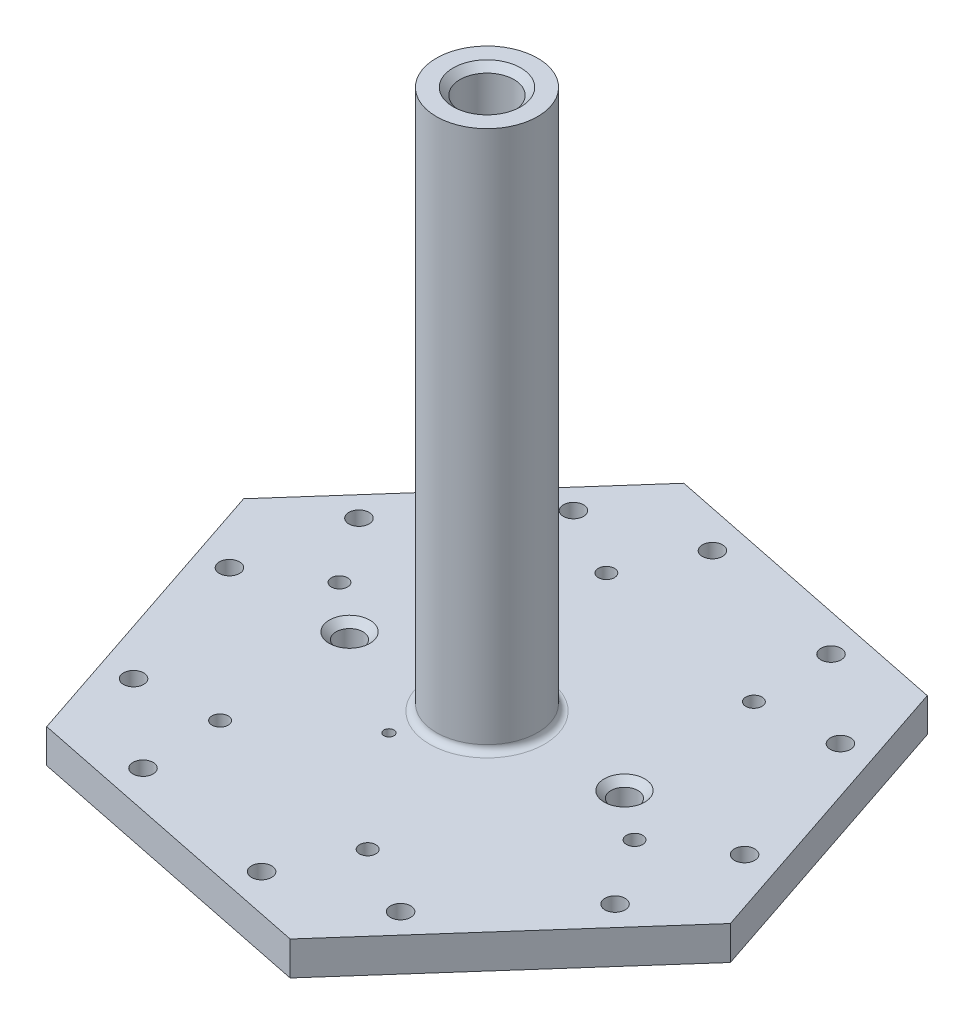
ISO-10303-21;
HEADER;
FILE_DESCRIPTION(('STEP AP214'),'2;1');
FILE_NAME('part.step','',(''),(''),'','','');
FILE_SCHEMA(('AUTOMOTIVE_DESIGN { 1 0 10303 214 1 1 1 1 }'));
ENDSEC;
DATA;
#1=APPLICATION_CONTEXT('core data for automotive mechanical design processes');
#2=APPLICATION_PROTOCOL_DEFINITION('international standard','automotive_design',2000,#1);
#3=PRODUCT_CONTEXT('',#1,'mechanical');
#4=PRODUCT('Part','Part','',(#3));
#5=PRODUCT_RELATED_PRODUCT_CATEGORY('part','',(#4));
#6=PRODUCT_DEFINITION_FORMATION('','',#4);
#7=PRODUCT_DEFINITION_CONTEXT('part definition',#1,'design');
#8=PRODUCT_DEFINITION('design','',#6,#7);
#9=PRODUCT_DEFINITION_SHAPE('','',#8);
#10=(LENGTH_UNIT() NAMED_UNIT(*) SI_UNIT(.MILLI.,.METRE.));
#11=(NAMED_UNIT(*) PLANE_ANGLE_UNIT() SI_UNIT($,.RADIAN.));
#12=(NAMED_UNIT(*) SI_UNIT($,.STERADIAN.) SOLID_ANGLE_UNIT());
#13=UNCERTAINTY_MEASURE_WITH_UNIT(LENGTH_MEASURE(1.E-05),#10,'distance_accuracy_value','');
#14=(GEOMETRIC_REPRESENTATION_CONTEXT(3) GLOBAL_UNCERTAINTY_ASSIGNED_CONTEXT((#13)) GLOBAL_UNIT_ASSIGNED_CONTEXT((#10,
#11,#12)) REPRESENTATION_CONTEXT('',''));
#15=CARTESIAN_POINT('',(0.,0.,0.));
#16=DIRECTION('',(0.,0.,1.));
#17=DIRECTION('',(1.,0.,0.));
#18=AXIS2_PLACEMENT_3D('',#15,#16,#17);
#19=CARTESIAN_POINT('',(0.,6.35,0.));
#20=DIRECTION('',(0.,1.,0.));
#21=DIRECTION('',(0.,0.,1.));
#22=AXIS2_PLACEMENT_3D('',#19,#20,#21);
#23=PLANE('',#22);
#24=CARTESIAN_POINT('',(4.94245146917436,6.35,47.3401714823136));
#25=DIRECTION('',(0.,1.,0.));
#26=DIRECTION('',(0.,0.,1.));
#27=AXIS2_PLACEMENT_3D('',#24,#25,#26);
#28=CIRCLE('',#27,1.89865000000001);
#29=CARTESIAN_POINT('',(4.94245146917436,6.35,49.2388214823136));
#30=VERTEX_POINT('',#29);
#31=EDGE_CURVE('E329',#30,#30,#28,.T.);
#32=ORIENTED_EDGE('',*,*,#31,.F.);
#33=EDGE_LOOP('',(#32));
#34=FACE_BOUND('',#33,.T.);
#35=CARTESIAN_POINT('',(-23.0581241038225,6.35,41.6394353385432));
#36=DIRECTION('',(0.,1.,0.));
#37=DIRECTION('',(0.,0.,1.));
#38=AXIS2_PLACEMENT_3D('',#35,#36,#37);
#39=CIRCLE('',#38,1.89865);
#40=CARTESIAN_POINT('',(-23.0581241038225,6.35,43.5380853385432));
#41=VERTEX_POINT('',#40);
#42=EDGE_CURVE('E331',#41,#41,#39,.T.);
#43=ORIENTED_EDGE('',*,*,#42,.F.);
#44=EDGE_LOOP('',(#43));
#45=FACE_BOUND('',#44,.T.);
#46=CARTESIAN_POINT('',(43.4690168577824,6.35,19.38979721188));
#47=DIRECTION('',(0.,1.,0.));
#48=DIRECTION('',(0.,0.,1.));
#49=AXIS2_PLACEMENT_3D('',#46,#47,#48);
#50=CIRCLE('',#49,1.89865);
#51=CARTESIAN_POINT('',(43.4690168577824,6.35,21.28844721188));
#52=VERTEX_POINT('',#51);
#53=EDGE_CURVE('E337',#52,#52,#50,.T.);
#54=ORIENTED_EDGE('',*,*,#53,.F.);
#55=EDGE_LOOP('',(#54));
#56=FACE_BOUND('',#55,.T.);
#57=CARTESIAN_POINT('',(24.5317467505067,6.35,40.7886389067961));
#58=DIRECTION('',(0.,1.,0.));
#59=DIRECTION('',(0.,0.,1.));
#60=AXIS2_PLACEMENT_3D('',#57,#58,#59);
#61=CIRCLE('',#60,1.89865);
#62=CARTESIAN_POINT('',(24.5317467505067,6.35,42.6872889067961));
#63=VERTEX_POINT('',#62);
#64=EDGE_CURVE('E343',#63,#63,#61,.T.);
#65=ORIENTED_EDGE('',*,*,#64,.F.);
#66=EDGE_LOOP('',(#65));
#67=FACE_BOUND('',#66,.T.);
#68=CARTESIAN_POINT('',(38.5265653886079,6.35,-27.9503742704337));
#69=DIRECTION('',(0.,1.,0.));
#70=DIRECTION('',(0.,0.,1.));
#71=AXIS2_PLACEMENT_3D('',#68,#69,#70);
#72=CIRCLE('',#71,1.89865);
#73=CARTESIAN_POINT('',(38.5265653886079,6.35,-26.0517242704337));
#74=VERTEX_POINT('',#73);
#75=EDGE_CURVE('E349',#74,#74,#72,.T.);
#76=ORIENTED_EDGE('',*,*,#75,.F.);
#77=EDGE_LOOP('',(#76));
#78=FACE_BOUND('',#77,.T.);
#79=CARTESIAN_POINT('',(47.5898708543291,6.35,-0.85079643174722));
#80=DIRECTION('',(0.,1.,0.));
#81=DIRECTION('',(0.,0.,1.));
#82=AXIS2_PLACEMENT_3D('',#79,#80,#81);
#83=CIRCLE('',#82,1.89865);
#84=CARTESIAN_POINT('',(47.5898708543291,6.35,1.04785356825278));
#85=VERTEX_POINT('',#84);
#86=EDGE_CURVE('E355',#85,#85,#83,.T.);
#87=ORIENTED_EDGE('',*,*,#86,.F.);
#88=EDGE_LOOP('',(#87));
#89=FACE_BOUND('',#88,.T.);
#90=CARTESIAN_POINT('',(-4.94245146917469,6.35,-47.3401714823136));
#91=DIRECTION('',(0.,1.,0.));
#92=DIRECTION('',(0.,0.,1.));
#93=AXIS2_PLACEMENT_3D('',#90,#91,#92);
#94=CIRCLE('',#93,1.89865000000001);
#95=CARTESIAN_POINT('',(-4.94245146917469,6.35,-45.4415214823136));
#96=VERTEX_POINT('',#95);
#97=EDGE_CURVE('E361',#96,#96,#94,.T.);
#98=ORIENTED_EDGE('',*,*,#97,.F.);
#99=EDGE_LOOP('',(#98));
#100=FACE_BOUND('',#99,.T.);
#101=CARTESIAN_POINT('',(23.0581241038222,6.35,-41.6394353385434));
#102=DIRECTION('',(0.,1.,0.));
#103=DIRECTION('',(0.,0.,1.));
#104=AXIS2_PLACEMENT_3D('',#101,#102,#103);
#105=CIRCLE('',#104,1.89865);
#106=CARTESIAN_POINT('',(23.0581241038222,6.35,-39.7407853385434));
#107=VERTEX_POINT('',#106);
#108=EDGE_CURVE('E367',#107,#107,#105,.T.);
#109=ORIENTED_EDGE('',*,*,#108,.F.);
#110=EDGE_LOOP('',(#109));
#111=FACE_BOUND('',#110,.T.);
#112=CARTESIAN_POINT('',(-43.4690168577826,6.35,-19.3897972118797));
#113=DIRECTION('',(0.,1.,0.));
#114=DIRECTION('',(0.,0.,1.));
#115=AXIS2_PLACEMENT_3D('',#112,#113,#114);
#116=CIRCLE('',#115,1.89865);
#117=CARTESIAN_POINT('',(-43.4690168577826,6.35,-17.4911472118797));
#118=VERTEX_POINT('',#117);
#119=EDGE_CURVE('E373',#118,#118,#116,.T.);
#120=ORIENTED_EDGE('',*,*,#119,.F.);
#121=EDGE_LOOP('',(#120));
#122=FACE_BOUND('',#121,.T.);
#123=CARTESIAN_POINT('',(-24.531746750507,6.35,-40.788638906796));
#124=DIRECTION('',(0.,1.,0.));
#125=DIRECTION('',(0.,0.,1.));
#126=AXIS2_PLACEMENT_3D('',#123,#124,#125);
#127=CIRCLE('',#126,1.89865);
#128=CARTESIAN_POINT('',(-24.531746750507,6.35,-38.889988906796));
#129=VERTEX_POINT('',#128);
#130=EDGE_CURVE('E379',#129,#129,#127,.T.);
#131=ORIENTED_EDGE('',*,*,#130,.F.);
#132=EDGE_LOOP('',(#131));
#133=FACE_BOUND('',#132,.T.);
#134=CARTESIAN_POINT('',(-38.5265653886077,6.35,27.950374270434));
#135=DIRECTION('',(0.,1.,0.));
#136=DIRECTION('',(0.,0.,1.));
#137=AXIS2_PLACEMENT_3D('',#134,#135,#136);
#138=CIRCLE('',#137,1.89865);
#139=CARTESIAN_POINT('',(-38.5265653886077,6.35,29.849024270434));
#140=VERTEX_POINT('',#139);
#141=EDGE_CURVE('E385',#140,#140,#138,.T.);
#142=ORIENTED_EDGE('',*,*,#141,.F.);
#143=EDGE_LOOP('',(#142));
#144=FACE_BOUND('',#143,.T.);
#145=CARTESIAN_POINT('',(-47.5898708543291,6.35,0.850796431747552));
#146=DIRECTION('',(0.,1.,0.));
#147=DIRECTION('',(0.,0.,1.));
#148=AXIS2_PLACEMENT_3D('',#145,#146,#147);
#149=CIRCLE('',#148,1.89865);
#150=CARTESIAN_POINT('',(-47.5898708543291,6.35,2.74944643174755));
#151=VERTEX_POINT('',#150);
#152=EDGE_CURVE('E391',#151,#151,#149,.T.);
#153=ORIENTED_EDGE('',*,*,#152,.F.);
#154=EDGE_LOOP('',(#153));
#155=FACE_BOUND('',#154,.T.);
#156=CARTESIAN_POINT('',(-23.5663805779425,6.34999999999999,26.6296696647828));
#157=DIRECTION('',(0.,1.,0.));
#158=DIRECTION('',(0.,0.,1.));
#159=AXIS2_PLACEMENT_3D('',#156,#157,#158);
#160=CIRCLE('',#159,1.524);
#161=CARTESIAN_POINT('',(-23.5663805779425,6.34999999999999,28.1536696647828));
#162=VERTEX_POINT('',#161);
#163=EDGE_CURVE('E402',#162,#162,#160,.T.);
#164=ORIENTED_EDGE('',*,*,#163,.F.);
#165=EDGE_LOOP('',(#164));
#166=FACE_BOUND('',#165,.T.);
#167=CARTESIAN_POINT('',(-34.8451607130606,6.34999999999999,-7.09424942336094));
#168=DIRECTION('',(0.,1.,0.));
#169=DIRECTION('',(0.,0.,1.));
#170=AXIS2_PLACEMENT_3D('',#167,#168,#169);
#171=CIRCLE('',#170,1.524);
#172=CARTESIAN_POINT('',(-34.8451607130606,6.34999999999999,-5.57024942336094));
#173=VERTEX_POINT('',#172);
#174=EDGE_CURVE('E408',#173,#173,#171,.T.);
#175=ORIENTED_EDGE('',*,*,#174,.F.);
#176=EDGE_LOOP('',(#175));
#177=FACE_BOUND('',#176,.T.);
#178=CARTESIAN_POINT('',(-11.2787801351162,6.34999999999999,-33.7239190881444));
#179=DIRECTION('',(0.,1.,0.));
#180=DIRECTION('',(0.,0.,1.));
#181=AXIS2_PLACEMENT_3D('',#178,#179,#180);
#182=CIRCLE('',#181,1.524);
#183=CARTESIAN_POINT('',(-11.2787801351162,6.34999999999999,-32.1999190881444));
#184=VERTEX_POINT('',#183);
#185=EDGE_CURVE('E414',#184,#184,#182,.T.);
#186=ORIENTED_EDGE('',*,*,#185,.F.);
#187=EDGE_LOOP('',(#186));
#188=FACE_BOUND('',#187,.T.);
#189=CARTESIAN_POINT('',(23.5663805779463,6.34999999999999,-26.6296696647841));
#190=DIRECTION('',(0.,1.,0.));
#191=DIRECTION('',(0.,0.,1.));
#192=AXIS2_PLACEMENT_3D('',#189,#190,#191);
#193=CIRCLE('',#192,1.524);
#194=CARTESIAN_POINT('',(23.5663805779463,6.34999999999999,-25.1056696647841));
#195=VERTEX_POINT('',#194);
#196=EDGE_CURVE('E420',#195,#195,#193,.T.);
#197=ORIENTED_EDGE('',*,*,#196,.F.);
#198=EDGE_LOOP('',(#197));
#199=FACE_BOUND('',#198,.T.);
#200=CARTESIAN_POINT('',(34.8451607130644,6.34999999999999,7.09424942335965));
#201=DIRECTION('',(0.,1.,0.));
#202=DIRECTION('',(0.,0.,1.));
#203=AXIS2_PLACEMENT_3D('',#200,#201,#202);
#204=CIRCLE('',#203,1.524);
#205=CARTESIAN_POINT('',(34.8451607130644,6.34999999999999,8.61824942335965));
#206=VERTEX_POINT('',#205);
#207=EDGE_CURVE('E426',#206,#206,#204,.T.);
#208=ORIENTED_EDGE('',*,*,#207,.F.);
#209=EDGE_LOOP('',(#208));
#210=FACE_BOUND('',#209,.T.);
#211=CARTESIAN_POINT('',(11.27878013512,6.34999999999999,33.7239190881431));
#212=DIRECTION('',(0.,1.,0.));
#213=DIRECTION('',(0.,0.,1.));
#214=AXIS2_PLACEMENT_3D('',#211,#212,#213);
#215=CIRCLE('',#214,1.524);
#216=CARTESIAN_POINT('',(11.27878013512,6.34999999999999,35.2479190881431));
#217=VERTEX_POINT('',#216);
#218=EDGE_CURVE('E182',#217,#217,#215,.T.);
#219=ORIENTED_EDGE('',*,*,#218,.F.);
#220=EDGE_LOOP('',(#219));
#221=FACE_BOUND('',#220,.T.);
#222=CARTESIAN_POINT('',(-25.8549980308621,6.35,0.));
#223=DIRECTION('',(0.,1.,0.));
#224=DIRECTION('',(0.,0.,1.));
#225=AXIS2_PLACEMENT_3D('',#222,#223,#224);
#226=CIRCLE('',#225,3.81000000000001);
#227=CARTESIAN_POINT('',(-25.8549980308621,6.35,3.81000000000001));
#228=VERTEX_POINT('',#227);
#229=EDGE_CURVE('E42',#228,#228,#226,.F.);
#230=ORIENTED_EDGE('',*,*,#229,.T.);
#231=EDGE_LOOP('',(#230));
#232=FACE_BOUND('',#231,.T.);
#233=CARTESIAN_POINT('',(25.8549980308621,6.35,0.));
#234=DIRECTION('',(0.,1.,0.));
#235=DIRECTION('',(0.,0.,1.));
#236=AXIS2_PLACEMENT_3D('',#233,#234,#235);
#237=CIRCLE('',#236,3.81000000000001);
#238=CARTESIAN_POINT('',(25.8549980308621,6.35,3.81000000000001));
#239=VERTEX_POINT('',#238);
#240=EDGE_CURVE('E153',#239,#239,#237,.F.);
#241=ORIENTED_EDGE('',*,*,#240,.T.);
#242=EDGE_LOOP('',(#241));
#243=FACE_BOUND('',#242,.T.);
#244=CARTESIAN_POINT('',(-5.68211090376942,6.35,12.7622300432669));
#245=DIRECTION('',(0.,1.,0.));
#246=DIRECTION('',(0.,0.,1.));
#247=AXIS2_PLACEMENT_3D('',#244,#245,#246);
#248=CIRCLE('',#247,0.952500000000001);
#249=CARTESIAN_POINT('',(-5.68211090376942,6.35,13.7147300432669));
#250=VERTEX_POINT('',#249);
#251=EDGE_CURVE('E175',#250,#250,#248,.T.);
#252=ORIENTED_EDGE('',*,*,#251,.F.);
#253=EDGE_LOOP('',(#252));
#254=FACE_BOUND('',#253,.T.);
#255=CARTESIAN_POINT('',(0.,6.35,0.));
#256=DIRECTION('',(0.,1.,0.));
#257=DIRECTION('',(0.,0.,1.));
#258=AXIS2_PLACEMENT_3D('',#255,#256,#257);
#259=CIRCLE('',#258,10.795);
#260=CARTESIAN_POINT('',(0.,6.35,10.795));
#261=VERTEX_POINT('',#260);
#262=EDGE_CURVE('E141',#261,#261,#259,.F.);
#263=ORIENTED_EDGE('',*,*,#262,.T.);
#264=EDGE_LOOP('',(#263));
#265=FACE_BOUND('',#264,.T.);
#266=DIRECTION('',(0.979897657847662,0.,0.199500827428524));
#267=VECTOR('',#266,1.);
#268=CARTESIAN_POINT('',(-38.8744462014299,6.35,43.9275627125551));
#269=LINE('',#268,#267);
#270=CARTESIAN_POINT('',(-38.8744462014299,6.35,43.9275627125551));
#271=VERTEX_POINT('',#270);
#272=CARTESIAN_POINT('',(18.6051621346919,6.35,55.6300393247673));
#273=VERTEX_POINT('',#272);
#274=EDGE_CURVE('E129',#271,#273,#269,.T.);
#275=ORIENTED_EDGE('',*,*,#274,.T.);
#276=DIRECTION('',(0.662721613552948,0.,-0.748865851090686));
#277=VECTOR('',#276,1.);
#278=CARTESIAN_POINT('',(18.6051621346919,6.35,55.6300393247673));
#279=LINE('',#278,#277);
#280=CARTESIAN_POINT('',(57.4796083361218,6.35,11.7024766122122));
#281=VERTEX_POINT('',#280);
#282=EDGE_CURVE('E88',#273,#281,#279,.T.);
#283=ORIENTED_EDGE('',*,*,#282,.T.);
#284=DIRECTION('',(-0.317176044294714,0.,-0.948366678519209));
#285=VECTOR('',#284,1.);
#286=CARTESIAN_POINT('',(57.4796083361218,6.35,11.7024766122122));
#287=LINE('',#286,#285);
#288=CARTESIAN_POINT('',(38.8744462014299,6.35,-43.9275627125552));
#289=VERTEX_POINT('',#288);
#290=EDGE_CURVE('E100',#281,#289,#287,.T.);
#291=ORIENTED_EDGE('',*,*,#290,.T.);
#292=DIRECTION('',(-0.979897657847662,0.,-0.199500827428524));
#293=VECTOR('',#292,1.);
#294=CARTESIAN_POINT('',(38.8744462014299,6.35,-43.9275627125552));
#295=LINE('',#294,#293);
#296=CARTESIAN_POINT('',(-18.6051621346919,6.35,-55.6300393247674));
#297=VERTEX_POINT('',#296);
#298=EDGE_CURVE('E95',#289,#297,#295,.T.);
#299=ORIENTED_EDGE('',*,*,#298,.T.);
#300=DIRECTION('',(-0.662721613552948,0.,0.748865851090686));
#301=VECTOR('',#300,1.);
#302=CARTESIAN_POINT('',(-18.6051621346919,6.35,-55.6300393247674));
#303=LINE('',#302,#301);
#304=CARTESIAN_POINT('',(-57.4796083361218,6.35,-11.7024766122122));
#305=VERTEX_POINT('',#304);
#306=EDGE_CURVE('E98',#297,#305,#303,.T.);
#307=ORIENTED_EDGE('',*,*,#306,.T.);
#308=DIRECTION('',(0.317176044294714,0.,0.948366678519209));
#309=VECTOR('',#308,1.);
#310=CARTESIAN_POINT('',(-57.4796083361218,6.35,-11.7024766122122));
#311=LINE('',#310,#309);
#312=EDGE_CURVE('E50',#305,#271,#311,.T.);
#313=ORIENTED_EDGE('',*,*,#312,.T.);
#314=EDGE_LOOP('',(#275,#283,#291,#299,#307,#313));
#315=FACE_BOUND('',#314,.T.);
#316=ADVANCED_FACE('F33',(#34,#45,#56,#67,#78,#89,#100,#111,#122,#133,#144,#155,#166,#177,#188,
#199,#210,#221,#232,#243,#254,#265,#315),#23,.T.);
#317=CARTESIAN_POINT('',(-38.8744462014299,6.35,43.9275627125551));
#318=DIRECTION('',(0.199500827428524,0.,-0.979897657847662));
#319=DIRECTION('',(-0.979897657847662,0.,-0.199500827428524));
#320=AXIS2_PLACEMENT_3D('',#317,#318,#319);
#321=PLANE('',#320);
#322=DIRECTION('',(0.979897657847662,0.,0.199500827428524));
#323=VECTOR('',#322,1.);
#324=CARTESIAN_POINT('',(-38.8744462014299,0.,43.9275627125551));
#325=LINE('',#324,#323);
#326=CARTESIAN_POINT('',(-38.8744462014299,0.,43.9275627125551));
#327=VERTEX_POINT('',#326);
#328=CARTESIAN_POINT('',(18.6051621346919,0.,55.6300393247673));
#329=VERTEX_POINT('',#328);
#330=EDGE_CURVE('E118',#327,#329,#325,.T.);
#331=ORIENTED_EDGE('',*,*,#330,.T.);
#332=DIRECTION('',(0.,-1.,0.));
#333=VECTOR('',#332,1.);
#334=CARTESIAN_POINT('',(18.6051621346919,6.35,55.6300393247673));
#335=LINE('',#334,#333);
#336=EDGE_CURVE('E136',#273,#329,#335,.T.);
#337=ORIENTED_EDGE('',*,*,#336,.F.);
#338=ORIENTED_EDGE('',*,*,#274,.F.);
#339=DIRECTION('',(0.,-1.,0.));
#340=VECTOR('',#339,1.);
#341=CARTESIAN_POINT('',(-38.8744462014299,6.35,43.9275627125551));
#342=LINE('',#341,#340);
#343=EDGE_CURVE('E114',#271,#327,#342,.T.);
#344=ORIENTED_EDGE('',*,*,#343,.T.);
#345=EDGE_LOOP('',(#331,#337,#338,#344));
#346=FACE_BOUND('',#345,.T.);
#347=ADVANCED_FACE('F204',(#346),#321,.F.);
#348=CARTESIAN_POINT('',(18.6051621346919,6.35,55.6300393247673));
#349=DIRECTION('',(-0.748865851090685,0.,-0.662721613552948));
#350=DIRECTION('',(-0.662721613552948,0.,0.748865851090686));
#351=AXIS2_PLACEMENT_3D('',#348,#349,#350);
#352=PLANE('',#351);
#353=DIRECTION('',(0.662721613552948,0.,-0.748865851090686));
#354=VECTOR('',#353,1.);
#355=CARTESIAN_POINT('',(18.6051621346919,0.,55.6300393247673));
#356=LINE('',#355,#354);
#357=CARTESIAN_POINT('',(57.4796083361218,0.,11.7024766122122));
#358=VERTEX_POINT('',#357);
#359=EDGE_CURVE('E121',#329,#358,#356,.T.);
#360=ORIENTED_EDGE('',*,*,#359,.T.);
#361=DIRECTION('',(0.,-1.,0.));
#362=VECTOR('',#361,1.);
#363=CARTESIAN_POINT('',(57.4796083361218,6.35,11.7024766122122));
#364=LINE('',#363,#362);
#365=EDGE_CURVE('E133',#281,#358,#364,.T.);
#366=ORIENTED_EDGE('',*,*,#365,.F.);
#367=ORIENTED_EDGE('',*,*,#282,.F.);
#368=ORIENTED_EDGE('',*,*,#336,.T.);
#369=EDGE_LOOP('',(#360,#366,#367,#368));
#370=FACE_BOUND('',#369,.T.);
#371=ADVANCED_FACE('F196',(#370),#352,.F.);
#372=CARTESIAN_POINT('',(57.4796083361218,6.35,11.7024766122122));
#373=DIRECTION('',(-0.948366678519209,0.,0.317176044294714));
#374=DIRECTION('',(0.317176044294714,0.,0.94836667851921));
#375=AXIS2_PLACEMENT_3D('',#372,#373,#374);
#376=PLANE('',#375);
#377=DIRECTION('',(-0.317176044294714,0.,-0.948366678519209));
#378=VECTOR('',#377,1.);
#379=CARTESIAN_POINT('',(57.4796083361218,0.,11.7024766122122));
#380=LINE('',#379,#378);
#381=CARTESIAN_POINT('',(38.8744462014299,0.,-43.9275627125552));
#382=VERTEX_POINT('',#381);
#383=EDGE_CURVE('E124',#358,#382,#380,.T.);
#384=ORIENTED_EDGE('',*,*,#383,.T.);
#385=DIRECTION('',(0.,-1.,0.));
#386=VECTOR('',#385,1.);
#387=CARTESIAN_POINT('',(38.8744462014299,6.35,-43.9275627125552));
#388=LINE('',#387,#386);
#389=EDGE_CURVE('E109',#289,#382,#388,.T.);
#390=ORIENTED_EDGE('',*,*,#389,.F.);
#391=ORIENTED_EDGE('',*,*,#290,.F.);
#392=ORIENTED_EDGE('',*,*,#365,.T.);
#393=EDGE_LOOP('',(#384,#390,#391,#392));
#394=FACE_BOUND('',#393,.T.);
#395=ADVANCED_FACE('F199',(#394),#376,.F.);
#396=CARTESIAN_POINT('',(38.8744462014299,6.35,-43.9275627125552));
#397=DIRECTION('',(-0.199500827428524,0.,0.979897657847662));
#398=DIRECTION('',(0.979897657847662,0.,0.199500827428524));
#399=AXIS2_PLACEMENT_3D('',#396,#397,#398);
#400=PLANE('',#399);
#401=DIRECTION('',(-0.979897657847662,0.,-0.199500827428524));
#402=VECTOR('',#401,1.);
#403=CARTESIAN_POINT('',(38.8744462014299,0.,-43.9275627125552));
#404=LINE('',#403,#402);
#405=CARTESIAN_POINT('',(-18.6051621346919,0.,-55.6300393247674));
#406=VERTEX_POINT('',#405);
#407=EDGE_CURVE('E108',#382,#406,#404,.T.);
#408=ORIENTED_EDGE('',*,*,#407,.T.);
#409=DIRECTION('',(0.,-1.,0.));
#410=VECTOR('',#409,1.);
#411=CARTESIAN_POINT('',(-18.6051621346919,6.35,-55.6300393247674));
#412=LINE('',#411,#410);
#413=EDGE_CURVE('E105',#297,#406,#412,.T.);
#414=ORIENTED_EDGE('',*,*,#413,.F.);
#415=ORIENTED_EDGE('',*,*,#298,.F.);
#416=ORIENTED_EDGE('',*,*,#389,.T.);
#417=EDGE_LOOP('',(#408,#414,#415,#416));
#418=FACE_BOUND('',#417,.T.);
#419=ADVANCED_FACE('F106',(#418),#400,.F.);
#420=CARTESIAN_POINT('',(-18.6051621346919,6.35,-55.6300393247674));
#421=DIRECTION('',(0.748865851090685,0.,0.662721613552948));
#422=DIRECTION('',(0.662721613552948,0.,-0.748865851090686));
#423=AXIS2_PLACEMENT_3D('',#420,#421,#422);
#424=PLANE('',#423);
#425=DIRECTION('',(-0.662721613552948,0.,0.748865851090686));
#426=VECTOR('',#425,1.);
#427=CARTESIAN_POINT('',(-18.6051621346919,0.,-55.6300393247674));
#428=LINE('',#427,#426);
#429=CARTESIAN_POINT('',(-57.4796083361218,0.,-11.7024766122122));
#430=VERTEX_POINT('',#429);
#431=EDGE_CURVE('E73',#406,#430,#428,.T.);
#432=ORIENTED_EDGE('',*,*,#431,.T.);
#433=DIRECTION('',(0.,-1.,0.));
#434=VECTOR('',#433,1.);
#435=CARTESIAN_POINT('',(-57.4796083361218,6.35,-11.7024766122122));
#436=LINE('',#435,#434);
#437=EDGE_CURVE('E110',#305,#430,#436,.T.);
#438=ORIENTED_EDGE('',*,*,#437,.F.);
#439=ORIENTED_EDGE('',*,*,#306,.F.);
#440=ORIENTED_EDGE('',*,*,#413,.T.);
#441=EDGE_LOOP('',(#432,#438,#439,#440));
#442=FACE_BOUND('',#441,.T.);
#443=ADVANCED_FACE('F112',(#442),#424,.F.);
#444=CARTESIAN_POINT('',(-57.4796083361218,6.35,-11.7024766122122));
#445=DIRECTION('',(0.948366678519209,0.,-0.317176044294714));
#446=DIRECTION('',(-0.317176044294714,0.,-0.948366678519209));
#447=AXIS2_PLACEMENT_3D('',#444,#445,#446);
#448=PLANE('',#447);
#449=DIRECTION('',(0.317176044294714,0.,0.948366678519209));
#450=VECTOR('',#449,1.);
#451=CARTESIAN_POINT('',(-57.4796083361218,0.,-11.7024766122122));
#452=LINE('',#451,#450);
#453=EDGE_CURVE('E79',#430,#327,#452,.T.);
#454=ORIENTED_EDGE('',*,*,#453,.T.);
#455=ORIENTED_EDGE('',*,*,#343,.F.);
#456=ORIENTED_EDGE('',*,*,#312,.F.);
#457=ORIENTED_EDGE('',*,*,#437,.T.);
#458=EDGE_LOOP('',(#454,#455,#456,#457));
#459=FACE_BOUND('',#458,.T.);
#460=ADVANCED_FACE('F205',(#459),#448,.F.);
#461=CARTESIAN_POINT('',(0.,0.,0.));
#462=DIRECTION('',(0.,1.,0.));
#463=DIRECTION('',(0.,0.,1.));
#464=AXIS2_PLACEMENT_3D('',#461,#462,#463);
#465=PLANE('',#464);
#466=CARTESIAN_POINT('',(4.94245146917436,0.,47.3401714823136));
#467=DIRECTION('',(0.,1.,0.));
#468=DIRECTION('',(0.,0.,1.));
#469=AXIS2_PLACEMENT_3D('',#466,#467,#468);
#470=CIRCLE('',#469,1.89865000000001);
#471=CARTESIAN_POINT('',(4.94245146917436,0.,49.2388214823136));
#472=VERTEX_POINT('',#471);
#473=EDGE_CURVE('E327',#472,#472,#470,.T.);
#474=ORIENTED_EDGE('',*,*,#473,.T.);
#475=EDGE_LOOP('',(#474));
#476=FACE_BOUND('',#475,.T.);
#477=CARTESIAN_POINT('',(-23.0581241038225,0.,41.6394353385432));
#478=DIRECTION('',(0.,1.,0.));
#479=DIRECTION('',(0.,0.,1.));
#480=AXIS2_PLACEMENT_3D('',#477,#478,#479);
#481=CIRCLE('',#480,1.89865);
#482=CARTESIAN_POINT('',(-23.0581241038225,0.,43.5380853385432));
#483=VERTEX_POINT('',#482);
#484=EDGE_CURVE('E334',#483,#483,#481,.T.);
#485=ORIENTED_EDGE('',*,*,#484,.T.);
#486=EDGE_LOOP('',(#485));
#487=FACE_BOUND('',#486,.T.);
#488=CARTESIAN_POINT('',(43.4690168577824,0.,19.38979721188));
#489=DIRECTION('',(0.,1.,0.));
#490=DIRECTION('',(0.,0.,1.));
#491=AXIS2_PLACEMENT_3D('',#488,#489,#490);
#492=CIRCLE('',#491,1.89865);
#493=CARTESIAN_POINT('',(43.4690168577824,0.,21.28844721188));
#494=VERTEX_POINT('',#493);
#495=EDGE_CURVE('E340',#494,#494,#492,.T.);
#496=ORIENTED_EDGE('',*,*,#495,.T.);
#497=EDGE_LOOP('',(#496));
#498=FACE_BOUND('',#497,.T.);
#499=CARTESIAN_POINT('',(24.5317467505067,0.,40.7886389067961));
#500=DIRECTION('',(0.,1.,0.));
#501=DIRECTION('',(0.,0.,1.));
#502=AXIS2_PLACEMENT_3D('',#499,#500,#501);
#503=CIRCLE('',#502,1.89865);
#504=CARTESIAN_POINT('',(24.5317467505067,0.,42.6872889067961));
#505=VERTEX_POINT('',#504);
#506=EDGE_CURVE('E346',#505,#505,#503,.T.);
#507=ORIENTED_EDGE('',*,*,#506,.T.);
#508=EDGE_LOOP('',(#507));
#509=FACE_BOUND('',#508,.T.);
#510=CARTESIAN_POINT('',(38.5265653886079,0.,-27.9503742704337));
#511=DIRECTION('',(0.,1.,0.));
#512=DIRECTION('',(0.,0.,1.));
#513=AXIS2_PLACEMENT_3D('',#510,#511,#512);
#514=CIRCLE('',#513,1.89865);
#515=CARTESIAN_POINT('',(38.5265653886079,0.,-26.0517242704337));
#516=VERTEX_POINT('',#515);
#517=EDGE_CURVE('E352',#516,#516,#514,.T.);
#518=ORIENTED_EDGE('',*,*,#517,.T.);
#519=EDGE_LOOP('',(#518));
#520=FACE_BOUND('',#519,.T.);
#521=CARTESIAN_POINT('',(47.5898708543291,0.,-0.85079643174722));
#522=DIRECTION('',(0.,1.,0.));
#523=DIRECTION('',(0.,0.,1.));
#524=AXIS2_PLACEMENT_3D('',#521,#522,#523);
#525=CIRCLE('',#524,1.89865);
#526=CARTESIAN_POINT('',(47.5898708543291,0.,1.04785356825278));
#527=VERTEX_POINT('',#526);
#528=EDGE_CURVE('E358',#527,#527,#525,.T.);
#529=ORIENTED_EDGE('',*,*,#528,.T.);
#530=EDGE_LOOP('',(#529));
#531=FACE_BOUND('',#530,.T.);
#532=CARTESIAN_POINT('',(-4.94245146917469,0.,-47.3401714823136));
#533=DIRECTION('',(0.,1.,0.));
#534=DIRECTION('',(0.,0.,1.));
#535=AXIS2_PLACEMENT_3D('',#532,#533,#534);
#536=CIRCLE('',#535,1.89865000000001);
#537=CARTESIAN_POINT('',(-4.94245146917469,0.,-45.4415214823136));
#538=VERTEX_POINT('',#537);
#539=EDGE_CURVE('E364',#538,#538,#536,.T.);
#540=ORIENTED_EDGE('',*,*,#539,.T.);
#541=EDGE_LOOP('',(#540));
#542=FACE_BOUND('',#541,.T.);
#543=CARTESIAN_POINT('',(23.0581241038222,0.,-41.6394353385434));
#544=DIRECTION('',(0.,1.,0.));
#545=DIRECTION('',(0.,0.,1.));
#546=AXIS2_PLACEMENT_3D('',#543,#544,#545);
#547=CIRCLE('',#546,1.89865);
#548=CARTESIAN_POINT('',(23.0581241038222,0.,-39.7407853385434));
#549=VERTEX_POINT('',#548);
#550=EDGE_CURVE('E370',#549,#549,#547,.T.);
#551=ORIENTED_EDGE('',*,*,#550,.T.);
#552=EDGE_LOOP('',(#551));
#553=FACE_BOUND('',#552,.T.);
#554=CARTESIAN_POINT('',(-43.4690168577826,0.,-19.3897972118797));
#555=DIRECTION('',(0.,1.,0.));
#556=DIRECTION('',(0.,0.,1.));
#557=AXIS2_PLACEMENT_3D('',#554,#555,#556);
#558=CIRCLE('',#557,1.89865);
#559=CARTESIAN_POINT('',(-43.4690168577826,0.,-17.4911472118797));
#560=VERTEX_POINT('',#559);
#561=EDGE_CURVE('E376',#560,#560,#558,.T.);
#562=ORIENTED_EDGE('',*,*,#561,.T.);
#563=EDGE_LOOP('',(#562));
#564=FACE_BOUND('',#563,.T.);
#565=CARTESIAN_POINT('',(-24.531746750507,0.,-40.788638906796));
#566=DIRECTION('',(0.,1.,0.));
#567=DIRECTION('',(0.,0.,1.));
#568=AXIS2_PLACEMENT_3D('',#565,#566,#567);
#569=CIRCLE('',#568,1.89865);
#570=CARTESIAN_POINT('',(-24.531746750507,0.,-38.889988906796));
#571=VERTEX_POINT('',#570);
#572=EDGE_CURVE('E382',#571,#571,#569,.T.);
#573=ORIENTED_EDGE('',*,*,#572,.T.);
#574=EDGE_LOOP('',(#573));
#575=FACE_BOUND('',#574,.T.);
#576=CARTESIAN_POINT('',(-38.5265653886077,0.,27.950374270434));
#577=DIRECTION('',(0.,1.,0.));
#578=DIRECTION('',(0.,0.,1.));
#579=AXIS2_PLACEMENT_3D('',#576,#577,#578);
#580=CIRCLE('',#579,1.89865);
#581=CARTESIAN_POINT('',(-38.5265653886077,0.,29.849024270434));
#582=VERTEX_POINT('',#581);
#583=EDGE_CURVE('E388',#582,#582,#580,.T.);
#584=ORIENTED_EDGE('',*,*,#583,.T.);
#585=EDGE_LOOP('',(#584));
#586=FACE_BOUND('',#585,.T.);
#587=CARTESIAN_POINT('',(-47.5898708543291,0.,0.850796431747552));
#588=DIRECTION('',(0.,1.,0.));
#589=DIRECTION('',(0.,0.,1.));
#590=AXIS2_PLACEMENT_3D('',#587,#588,#589);
#591=CIRCLE('',#590,1.89865);
#592=CARTESIAN_POINT('',(-47.5898708543291,0.,2.74944643174755));
#593=VERTEX_POINT('',#592);
#594=EDGE_CURVE('E394',#593,#593,#591,.T.);
#595=ORIENTED_EDGE('',*,*,#594,.T.);
#596=EDGE_LOOP('',(#595));
#597=FACE_BOUND('',#596,.T.);
#598=CARTESIAN_POINT('',(-23.5663805779425,0.,26.6296696647828));
#599=DIRECTION('',(0.,-1.,0.));
#600=DIRECTION('',(0.,0.,-1.));
#601=AXIS2_PLACEMENT_3D('',#598,#599,#600);
#602=CIRCLE('',#601,1.524);
#603=CARTESIAN_POINT('',(-23.5663805779425,0.,25.1056696647828));
#604=VERTEX_POINT('',#603);
#605=EDGE_CURVE('E397',#604,#604,#602,.T.);
#606=ORIENTED_EDGE('',*,*,#605,.F.);
#607=EDGE_LOOP('',(#606));
#608=FACE_BOUND('',#607,.T.);
#609=CARTESIAN_POINT('',(-34.8451607130606,0.,-7.09424942336094));
#610=DIRECTION('',(0.,-1.,0.));
#611=DIRECTION('',(0.,0.,-1.));
#612=AXIS2_PLACEMENT_3D('',#609,#610,#611);
#613=CIRCLE('',#612,1.524);
#614=CARTESIAN_POINT('',(-34.8451607130606,0.,-8.61824942336093));
#615=VERTEX_POINT('',#614);
#616=EDGE_CURVE('E405',#615,#615,#613,.T.);
#617=ORIENTED_EDGE('',*,*,#616,.F.);
#618=EDGE_LOOP('',(#617));
#619=FACE_BOUND('',#618,.T.);
#620=CARTESIAN_POINT('',(-11.2787801351162,0.,-33.7239190881444));
#621=DIRECTION('',(0.,-1.,0.));
#622=DIRECTION('',(0.,0.,-1.));
#623=AXIS2_PLACEMENT_3D('',#620,#621,#622);
#624=CIRCLE('',#623,1.524);
#625=CARTESIAN_POINT('',(-11.2787801351162,0.,-35.2479190881444));
#626=VERTEX_POINT('',#625);
#627=EDGE_CURVE('E411',#626,#626,#624,.T.);
#628=ORIENTED_EDGE('',*,*,#627,.F.);
#629=EDGE_LOOP('',(#628));
#630=FACE_BOUND('',#629,.T.);
#631=CARTESIAN_POINT('',(23.5663805779463,0.,-26.6296696647841));
#632=DIRECTION('',(0.,-1.,0.));
#633=DIRECTION('',(0.,0.,-1.));
#634=AXIS2_PLACEMENT_3D('',#631,#632,#633);
#635=CIRCLE('',#634,1.524);
#636=CARTESIAN_POINT('',(23.5663805779463,0.,-28.1536696647841));
#637=VERTEX_POINT('',#636);
#638=EDGE_CURVE('E417',#637,#637,#635,.T.);
#639=ORIENTED_EDGE('',*,*,#638,.F.);
#640=EDGE_LOOP('',(#639));
#641=FACE_BOUND('',#640,.T.);
#642=CARTESIAN_POINT('',(34.8451607130644,0.,7.09424942335965));
#643=DIRECTION('',(0.,-1.,0.));
#644=DIRECTION('',(0.,0.,-1.));
#645=AXIS2_PLACEMENT_3D('',#642,#643,#644);
#646=CIRCLE('',#645,1.524);
#647=CARTESIAN_POINT('',(34.8451607130644,0.,5.57024942335965));
#648=VERTEX_POINT('',#647);
#649=EDGE_CURVE('E423',#648,#648,#646,.T.);
#650=ORIENTED_EDGE('',*,*,#649,.F.);
#651=EDGE_LOOP('',(#650));
#652=FACE_BOUND('',#651,.T.);
#653=CARTESIAN_POINT('',(11.27878013512,0.,33.7239190881431));
#654=DIRECTION('',(0.,-1.,0.));
#655=DIRECTION('',(0.,0.,-1.));
#656=AXIS2_PLACEMENT_3D('',#653,#654,#655);
#657=CIRCLE('',#656,1.524);
#658=CARTESIAN_POINT('',(11.27878013512,0.,32.1999190881431));
#659=VERTEX_POINT('',#658);
#660=EDGE_CURVE('E429',#659,#659,#657,.T.);
#661=ORIENTED_EDGE('',*,*,#660,.F.);
#662=EDGE_LOOP('',(#661));
#663=FACE_BOUND('',#662,.T.);
#664=CARTESIAN_POINT('',(25.8549980308621,0.,0.));
#665=DIRECTION('',(0.,1.,0.));
#666=DIRECTION('',(0.,0.,1.));
#667=AXIS2_PLACEMENT_3D('',#664,#665,#666);
#668=CIRCLE('',#667,2.54);
#669=CARTESIAN_POINT('',(25.8549980308621,0.,2.54));
#670=VERTEX_POINT('',#669);
#671=EDGE_CURVE('E176',#670,#670,#668,.T.);
#672=ORIENTED_EDGE('',*,*,#671,.T.);
#673=EDGE_LOOP('',(#672));
#674=FACE_BOUND('',#673,.T.);
#675=CARTESIAN_POINT('',(-25.8549980308621,0.,0.));
#676=DIRECTION('',(0.,1.,0.));
#677=DIRECTION('',(0.,0.,1.));
#678=AXIS2_PLACEMENT_3D('',#675,#676,#677);
#679=CIRCLE('',#678,2.54);
#680=CARTESIAN_POINT('',(-25.8549980308621,0.,2.54));
#681=VERTEX_POINT('',#680);
#682=EDGE_CURVE('E173',#681,#681,#679,.T.);
#683=ORIENTED_EDGE('',*,*,#682,.T.);
#684=EDGE_LOOP('',(#683));
#685=FACE_BOUND('',#684,.T.);
#686=CARTESIAN_POINT('',(-5.68211090376942,0.,12.7622300432669));
#687=DIRECTION('',(0.,1.,0.));
#688=DIRECTION('',(0.,0.,1.));
#689=AXIS2_PLACEMENT_3D('',#686,#687,#688);
#690=CIRCLE('',#689,0.952500000000001);
#691=CARTESIAN_POINT('',(-5.68211090376942,0.,13.7147300432669));
#692=VERTEX_POINT('',#691);
#693=EDGE_CURVE('E179',#692,#692,#690,.T.);
#694=ORIENTED_EDGE('',*,*,#693,.T.);
#695=EDGE_LOOP('',(#694));
#696=FACE_BOUND('',#695,.T.);
#697=ORIENTED_EDGE('',*,*,#330,.F.);
#698=ORIENTED_EDGE('',*,*,#453,.F.);
#699=ORIENTED_EDGE('',*,*,#431,.F.);
#700=ORIENTED_EDGE('',*,*,#407,.F.);
#701=ORIENTED_EDGE('',*,*,#383,.F.);
#702=ORIENTED_EDGE('',*,*,#359,.F.);
#703=EDGE_LOOP('',(#697,#698,#699,#700,#701,#702));
#704=FACE_BOUND('',#703,.T.);
#705=ADVANCED_FACE('F202',(#476,#487,#498,#509,#520,#531,#542,#553,#564,#575,#586,#597,#608,
#619,#630,#641,#652,#663,#674,#685,#696,#704),#465,.F.);
#706=CARTESIAN_POINT('',(0.,107.95,0.));
#707=DIRECTION('',(0.,-1.,0.));
#708=DIRECTION('',(0.,0.,-1.));
#709=AXIS2_PLACEMENT_3D('',#706,#707,#708);
#710=CYLINDRICAL_SURFACE('',#709,9.525);
#711=CARTESIAN_POINT('',(0.,7.62,0.));
#712=DIRECTION('',(0.,1.,0.));
#713=DIRECTION('',(0.,0.,1.));
#714=AXIS2_PLACEMENT_3D('',#711,#712,#713);
#715=CIRCLE('',#714,9.525);
#716=CARTESIAN_POINT('',(0.,7.62,9.525));
#717=VERTEX_POINT('',#716);
#718=EDGE_CURVE('E138',#717,#717,#715,.T.);
#719=ORIENTED_EDGE('',*,*,#718,.T.);
#720=EDGE_LOOP('',(#719));
#721=FACE_BOUND('',#720,.T.);
#722=CARTESIAN_POINT('',(0.,107.95,0.));
#723=DIRECTION('',(0.,1.,0.));
#724=DIRECTION('',(0.,0.,1.));
#725=AXIS2_PLACEMENT_3D('',#722,#723,#724);
#726=CIRCLE('',#725,9.525);
#727=CARTESIAN_POINT('',(0.,107.95,9.525));
#728=VERTEX_POINT('',#727);
#729=EDGE_CURVE('E122',#728,#728,#726,.T.);
#730=ORIENTED_EDGE('',*,*,#729,.F.);
#731=EDGE_LOOP('',(#730));
#732=FACE_BOUND('',#731,.T.);
#733=ADVANCED_FACE('F213',(#721,#732),#710,.T.);
#734=CARTESIAN_POINT('',(0.,107.95,0.));
#735=DIRECTION('',(0.,1.,0.));
#736=DIRECTION('',(0.,0.,1.));
#737=AXIS2_PLACEMENT_3D('',#734,#735,#736);
#738=PLANE('',#737);
#739=CARTESIAN_POINT('',(0.,107.95,0.));
#740=DIRECTION('',(0.,1.,0.));
#741=DIRECTION('',(0.,0.,1.));
#742=AXIS2_PLACEMENT_3D('',#739,#740,#741);
#743=CIRCLE('',#742,6.34999999999999);
#744=CARTESIAN_POINT('',(0.,107.95,6.34999999999999));
#745=VERTEX_POINT('',#744);
#746=EDGE_CURVE('E147',#745,#745,#743,.F.);
#747=ORIENTED_EDGE('',*,*,#746,.T.);
#748=EDGE_LOOP('',(#747));
#749=FACE_BOUND('',#748,.T.);
#750=ORIENTED_EDGE('',*,*,#729,.T.);
#751=EDGE_LOOP('',(#750));
#752=FACE_BOUND('',#751,.T.);
#753=ADVANCED_FACE('F230',(#749,#752),#738,.T.);
#754=CARTESIAN_POINT('',(0.,7.62,0.));
#755=DIRECTION('',(0.,1.,0.));
#756=DIRECTION('',(0.,0.,1.));
#757=AXIS2_PLACEMENT_3D('',#754,#755,#756);
#758=TOROIDAL_SURFACE('',#757,10.795,1.27);
#759=ORIENTED_EDGE('',*,*,#262,.F.);
#760=EDGE_LOOP('',(#759));
#761=FACE_BOUND('',#760,.T.);
#762=ORIENTED_EDGE('',*,*,#718,.F.);
#763=EDGE_LOOP('',(#762));
#764=FACE_BOUND('',#763,.T.);
#765=ADVANCED_FACE('F234',(#761,#764),#758,.F.);
#766=CARTESIAN_POINT('',(0.,99.06,0.));
#767=DIRECTION('',(0.,1.,0.));
#768=DIRECTION('',(0.,0.,1.));
#769=AXIS2_PLACEMENT_3D('',#766,#767,#768);
#770=CYLINDRICAL_SURFACE('',#769,5.08);
#771=CARTESIAN_POINT('',(0.,106.68,0.));
#772=DIRECTION('',(0.,1.,0.));
#773=DIRECTION('',(0.,0.,1.));
#774=AXIS2_PLACEMENT_3D('',#771,#772,#773);
#775=CIRCLE('',#774,5.08);
#776=CARTESIAN_POINT('',(0.,106.68,5.08));
#777=VERTEX_POINT('',#776);
#778=EDGE_CURVE('E144',#777,#777,#775,.T.);
#779=ORIENTED_EDGE('',*,*,#778,.T.);
#780=EDGE_LOOP('',(#779));
#781=FACE_BOUND('',#780,.T.);
#782=CARTESIAN_POINT('',(0.,99.06,0.));
#783=DIRECTION('',(0.,1.,0.));
#784=DIRECTION('',(0.,0.,1.));
#785=AXIS2_PLACEMENT_3D('',#782,#783,#784);
#786=CIRCLE('',#785,5.08);
#787=CARTESIAN_POINT('',(0.,99.06,5.08));
#788=VERTEX_POINT('',#787);
#789=EDGE_CURVE('E187',#788,#788,#786,.T.);
#790=ORIENTED_EDGE('',*,*,#789,.F.);
#791=EDGE_LOOP('',(#790));
#792=FACE_BOUND('',#791,.T.);
#793=ADVANCED_FACE('F236',(#781,#792),#770,.F.);
#794=CARTESIAN_POINT('',(0.,99.06,0.));
#795=DIRECTION('',(0.,1.,0.));
#796=DIRECTION('',(0.,0.,1.));
#797=AXIS2_PLACEMENT_3D('',#794,#795,#796);
#798=PLANE('',#797);
#799=ORIENTED_EDGE('',*,*,#789,.T.);
#800=EDGE_LOOP('',(#799));
#801=FACE_BOUND('',#800,.T.);
#802=ADVANCED_FACE('F239',(#801),#798,.T.);
#803=CARTESIAN_POINT('',(0.,106.68,0.));
#804=DIRECTION('',(0.,1.,0.));
#805=DIRECTION('',(0.,0.,1.));
#806=AXIS2_PLACEMENT_3D('',#803,#804,#805);
#807=CONICAL_SURFACE('',#806,5.08,0.785398163397443);
#808=ORIENTED_EDGE('',*,*,#746,.F.);
#809=EDGE_LOOP('',(#808));
#810=FACE_BOUND('',#809,.T.);
#811=ORIENTED_EDGE('',*,*,#778,.F.);
#812=EDGE_LOOP('',(#811));
#813=FACE_BOUND('',#812,.T.);
#814=ADVANCED_FACE('F243',(#810,#813),#807,.F.);
#815=CARTESIAN_POINT('',(-5.68211090376942,0.,12.7622300432669));
#816=DIRECTION('',(0.,1.,0.));
#817=DIRECTION('',(0.,0.,1.));
#818=AXIS2_PLACEMENT_3D('',#815,#816,#817);
#819=CYLINDRICAL_SURFACE('',#818,0.952500000000001);
#820=ORIENTED_EDGE('',*,*,#693,.F.);
#821=EDGE_LOOP('',(#820));
#822=FACE_BOUND('',#821,.T.);
#823=ORIENTED_EDGE('',*,*,#251,.T.);
#824=EDGE_LOOP('',(#823));
#825=FACE_BOUND('',#824,.T.);
#826=ADVANCED_FACE('F169',(#822,#825),#819,.F.);
#827=CARTESIAN_POINT('',(-25.8549980308621,0.,0.));
#828=DIRECTION('',(0.,1.,0.));
#829=DIRECTION('',(0.,0.,1.));
#830=AXIS2_PLACEMENT_3D('',#827,#828,#829);
#831=CYLINDRICAL_SURFACE('',#830,2.54);
#832=CARTESIAN_POINT('',(-25.8549980308621,5.07999999999999,0.));
#833=DIRECTION('',(0.,1.,0.));
#834=DIRECTION('',(0.,0.,1.));
#835=AXIS2_PLACEMENT_3D('',#832,#833,#834);
#836=CIRCLE('',#835,2.54);
#837=CARTESIAN_POINT('',(-25.8549980308621,5.07999999999999,2.54));
#838=VERTEX_POINT('',#837);
#839=EDGE_CURVE('E150',#838,#838,#836,.T.);
#840=ORIENTED_EDGE('',*,*,#839,.T.);
#841=EDGE_LOOP('',(#840));
#842=FACE_BOUND('',#841,.T.);
#843=ORIENTED_EDGE('',*,*,#682,.F.);
#844=EDGE_LOOP('',(#843));
#845=FACE_BOUND('',#844,.T.);
#846=ADVANCED_FACE('F166',(#842,#845),#831,.F.);
#847=CARTESIAN_POINT('',(25.8549980308621,0.,0.));
#848=DIRECTION('',(0.,1.,0.));
#849=DIRECTION('',(0.,0.,1.));
#850=AXIS2_PLACEMENT_3D('',#847,#848,#849);
#851=CYLINDRICAL_SURFACE('',#850,2.54);
#852=CARTESIAN_POINT('',(25.8549980308621,5.07999999999999,0.));
#853=DIRECTION('',(0.,1.,0.));
#854=DIRECTION('',(0.,0.,1.));
#855=AXIS2_PLACEMENT_3D('',#852,#853,#854);
#856=CIRCLE('',#855,2.54);
#857=CARTESIAN_POINT('',(25.8549980308621,5.07999999999999,2.54));
#858=VERTEX_POINT('',#857);
#859=EDGE_CURVE('E11',#858,#858,#856,.T.);
#860=ORIENTED_EDGE('',*,*,#859,.T.);
#861=EDGE_LOOP('',(#860));
#862=FACE_BOUND('',#861,.T.);
#863=ORIENTED_EDGE('',*,*,#671,.F.);
#864=EDGE_LOOP('',(#863));
#865=FACE_BOUND('',#864,.T.);
#866=ADVANCED_FACE('F163',(#862,#865),#851,.F.);
#867=CARTESIAN_POINT('',(-25.8549980308621,5.07999999999999,0.));
#868=DIRECTION('',(0.,1.,0.));
#869=DIRECTION('',(0.,0.,1.));
#870=AXIS2_PLACEMENT_3D('',#867,#868,#869);
#871=CONICAL_SURFACE('',#870,2.54,0.785398163397445);
#872=ORIENTED_EDGE('',*,*,#229,.F.);
#873=EDGE_LOOP('',(#872));
#874=FACE_BOUND('',#873,.T.);
#875=ORIENTED_EDGE('',*,*,#839,.F.);
#876=EDGE_LOOP('',(#875));
#877=FACE_BOUND('',#876,.T.);
#878=ADVANCED_FACE('F160',(#874,#877),#871,.F.);
#879=CARTESIAN_POINT('',(25.8549980308621,5.07999999999999,0.));
#880=DIRECTION('',(0.,1.,0.));
#881=DIRECTION('',(0.,0.,1.));
#882=AXIS2_PLACEMENT_3D('',#879,#880,#881);
#883=CONICAL_SURFACE('',#882,2.54,0.785398163397445);
#884=ORIENTED_EDGE('',*,*,#240,.F.);
#885=EDGE_LOOP('',(#884));
#886=FACE_BOUND('',#885,.T.);
#887=ORIENTED_EDGE('',*,*,#859,.F.);
#888=EDGE_LOOP('',(#887));
#889=FACE_BOUND('',#888,.T.);
#890=ADVANCED_FACE('F35',(#886,#889),#883,.F.);
#891=CARTESIAN_POINT('',(11.27878013512,107.95,33.7239190881431));
#892=DIRECTION('',(0.,-1.,0.));
#893=DIRECTION('',(0.,0.,-1.));
#894=AXIS2_PLACEMENT_3D('',#891,#892,#893);
#895=CYLINDRICAL_SURFACE('',#894,1.524);
#896=ORIENTED_EDGE('',*,*,#218,.T.);
#897=EDGE_LOOP('',(#896));
#898=FACE_BOUND('',#897,.T.);
#899=ORIENTED_EDGE('',*,*,#660,.T.);
#900=EDGE_LOOP('',(#899));
#901=FACE_BOUND('',#900,.T.);
#902=ADVANCED_FACE('F251',(#898,#901),#895,.F.);
#903=CARTESIAN_POINT('',(34.8451607130644,107.95,7.09424942335965));
#904=DIRECTION('',(0.,-1.,0.));
#905=DIRECTION('',(0.,0.,-1.));
#906=AXIS2_PLACEMENT_3D('',#903,#904,#905);
#907=CYLINDRICAL_SURFACE('',#906,1.524);
#908=ORIENTED_EDGE('',*,*,#207,.T.);
#909=EDGE_LOOP('',(#908));
#910=FACE_BOUND('',#909,.T.);
#911=ORIENTED_EDGE('',*,*,#649,.T.);
#912=EDGE_LOOP('',(#911));
#913=FACE_BOUND('',#912,.T.);
#914=ADVANCED_FACE('F254',(#910,#913),#907,.F.);
#915=CARTESIAN_POINT('',(23.5663805779463,107.95,-26.6296696647841));
#916=DIRECTION('',(0.,-1.,0.));
#917=DIRECTION('',(0.,0.,-1.));
#918=AXIS2_PLACEMENT_3D('',#915,#916,#917);
#919=CYLINDRICAL_SURFACE('',#918,1.524);
#920=ORIENTED_EDGE('',*,*,#196,.T.);
#921=EDGE_LOOP('',(#920));
#922=FACE_BOUND('',#921,.T.);
#923=ORIENTED_EDGE('',*,*,#638,.T.);
#924=EDGE_LOOP('',(#923));
#925=FACE_BOUND('',#924,.T.);
#926=ADVANCED_FACE('F258',(#922,#925),#919,.F.);
#927=CARTESIAN_POINT('',(-11.2787801351162,107.95,-33.7239190881444));
#928=DIRECTION('',(0.,-1.,0.));
#929=DIRECTION('',(0.,0.,-1.));
#930=AXIS2_PLACEMENT_3D('',#927,#928,#929);
#931=CYLINDRICAL_SURFACE('',#930,1.524);
#932=ORIENTED_EDGE('',*,*,#185,.T.);
#933=EDGE_LOOP('',(#932));
#934=FACE_BOUND('',#933,.T.);
#935=ORIENTED_EDGE('',*,*,#627,.T.);
#936=EDGE_LOOP('',(#935));
#937=FACE_BOUND('',#936,.T.);
#938=ADVANCED_FACE('F262',(#934,#937),#931,.F.);
#939=CARTESIAN_POINT('',(-34.8451607130606,107.95,-7.09424942336094));
#940=DIRECTION('',(0.,-1.,0.));
#941=DIRECTION('',(0.,0.,-1.));
#942=AXIS2_PLACEMENT_3D('',#939,#940,#941);
#943=CYLINDRICAL_SURFACE('',#942,1.524);
#944=ORIENTED_EDGE('',*,*,#174,.T.);
#945=EDGE_LOOP('',(#944));
#946=FACE_BOUND('',#945,.T.);
#947=ORIENTED_EDGE('',*,*,#616,.T.);
#948=EDGE_LOOP('',(#947));
#949=FACE_BOUND('',#948,.T.);
#950=ADVANCED_FACE('F266',(#946,#949),#943,.F.);
#951=CARTESIAN_POINT('',(-23.5663805779425,107.95,26.6296696647828));
#952=DIRECTION('',(0.,-1.,0.));
#953=DIRECTION('',(0.,0.,-1.));
#954=AXIS2_PLACEMENT_3D('',#951,#952,#953);
#955=CYLINDRICAL_SURFACE('',#954,1.524);
#956=ORIENTED_EDGE('',*,*,#163,.T.);
#957=EDGE_LOOP('',(#956));
#958=FACE_BOUND('',#957,.T.);
#959=ORIENTED_EDGE('',*,*,#605,.T.);
#960=EDGE_LOOP('',(#959));
#961=FACE_BOUND('',#960,.T.);
#962=ADVANCED_FACE('F270',(#958,#961),#955,.F.);
#963=CARTESIAN_POINT('',(-47.5898708543291,0.,0.850796431747552));
#964=DIRECTION('',(0.,1.,0.));
#965=DIRECTION('',(0.,0.,1.));
#966=AXIS2_PLACEMENT_3D('',#963,#964,#965);
#967=CYLINDRICAL_SURFACE('',#966,1.89865);
#968=ORIENTED_EDGE('',*,*,#594,.F.);
#969=EDGE_LOOP('',(#968));
#970=FACE_BOUND('',#969,.T.);
#971=ORIENTED_EDGE('',*,*,#152,.T.);
#972=EDGE_LOOP('',(#971));
#973=FACE_BOUND('',#972,.T.);
#974=ADVANCED_FACE('F274',(#970,#973),#967,.F.);
#975=CARTESIAN_POINT('',(-38.5265653886077,0.,27.950374270434));
#976=DIRECTION('',(0.,1.,0.));
#977=DIRECTION('',(0.,0.,1.));
#978=AXIS2_PLACEMENT_3D('',#975,#976,#977);
#979=CYLINDRICAL_SURFACE('',#978,1.89865);
#980=ORIENTED_EDGE('',*,*,#583,.F.);
#981=EDGE_LOOP('',(#980));
#982=FACE_BOUND('',#981,.T.);
#983=ORIENTED_EDGE('',*,*,#141,.T.);
#984=EDGE_LOOP('',(#983));
#985=FACE_BOUND('',#984,.T.);
#986=ADVANCED_FACE('F278',(#982,#985),#979,.F.);
#987=CARTESIAN_POINT('',(-24.531746750507,0.,-40.788638906796));
#988=DIRECTION('',(0.,1.,0.));
#989=DIRECTION('',(0.,0.,1.));
#990=AXIS2_PLACEMENT_3D('',#987,#988,#989);
#991=CYLINDRICAL_SURFACE('',#990,1.89865);
#992=ORIENTED_EDGE('',*,*,#572,.F.);
#993=EDGE_LOOP('',(#992));
#994=FACE_BOUND('',#993,.T.);
#995=ORIENTED_EDGE('',*,*,#130,.T.);
#996=EDGE_LOOP('',(#995));
#997=FACE_BOUND('',#996,.T.);
#998=ADVANCED_FACE('F282',(#994,#997),#991,.F.);
#999=CARTESIAN_POINT('',(-43.4690168577826,0.,-19.3897972118797));
#1000=DIRECTION('',(0.,1.,0.));
#1001=DIRECTION('',(0.,0.,1.));
#1002=AXIS2_PLACEMENT_3D('',#999,#1000,#1001);
#1003=CYLINDRICAL_SURFACE('',#1002,1.89865);
#1004=ORIENTED_EDGE('',*,*,#561,.F.);
#1005=EDGE_LOOP('',(#1004));
#1006=FACE_BOUND('',#1005,.T.);
#1007=ORIENTED_EDGE('',*,*,#119,.T.);
#1008=EDGE_LOOP('',(#1007));
#1009=FACE_BOUND('',#1008,.T.);
#1010=ADVANCED_FACE('F286',(#1006,#1009),#1003,.F.);
#1011=CARTESIAN_POINT('',(23.0581241038222,0.,-41.6394353385434));
#1012=DIRECTION('',(0.,1.,0.));
#1013=DIRECTION('',(0.,0.,1.));
#1014=AXIS2_PLACEMENT_3D('',#1011,#1012,#1013);
#1015=CYLINDRICAL_SURFACE('',#1014,1.89865);
#1016=ORIENTED_EDGE('',*,*,#550,.F.);
#1017=EDGE_LOOP('',(#1016));
#1018=FACE_BOUND('',#1017,.T.);
#1019=ORIENTED_EDGE('',*,*,#108,.T.);
#1020=EDGE_LOOP('',(#1019));
#1021=FACE_BOUND('',#1020,.T.);
#1022=ADVANCED_FACE('F290',(#1018,#1021),#1015,.F.);
#1023=CARTESIAN_POINT('',(-4.94245146917469,0.,-47.3401714823136));
#1024=DIRECTION('',(0.,1.,0.));
#1025=DIRECTION('',(0.,0.,1.));
#1026=AXIS2_PLACEMENT_3D('',#1023,#1024,#1025);
#1027=CYLINDRICAL_SURFACE('',#1026,1.89865000000001);
#1028=ORIENTED_EDGE('',*,*,#539,.F.);
#1029=EDGE_LOOP('',(#1028));
#1030=FACE_BOUND('',#1029,.T.);
#1031=ORIENTED_EDGE('',*,*,#97,.T.);
#1032=EDGE_LOOP('',(#1031));
#1033=FACE_BOUND('',#1032,.T.);
#1034=ADVANCED_FACE('F294',(#1030,#1033),#1027,.F.);
#1035=CARTESIAN_POINT('',(47.5898708543291,0.,-0.85079643174722));
#1036=DIRECTION('',(0.,1.,0.));
#1037=DIRECTION('',(0.,0.,1.));
#1038=AXIS2_PLACEMENT_3D('',#1035,#1036,#1037);
#1039=CYLINDRICAL_SURFACE('',#1038,1.89865);
#1040=ORIENTED_EDGE('',*,*,#528,.F.);
#1041=EDGE_LOOP('',(#1040));
#1042=FACE_BOUND('',#1041,.T.);
#1043=ORIENTED_EDGE('',*,*,#86,.T.);
#1044=EDGE_LOOP('',(#1043));
#1045=FACE_BOUND('',#1044,.T.);
#1046=ADVANCED_FACE('F298',(#1042,#1045),#1039,.F.);
#1047=CARTESIAN_POINT('',(38.5265653886079,0.,-27.9503742704337));
#1048=DIRECTION('',(0.,1.,0.));
#1049=DIRECTION('',(0.,0.,1.));
#1050=AXIS2_PLACEMENT_3D('',#1047,#1048,#1049);
#1051=CYLINDRICAL_SURFACE('',#1050,1.89865);
#1052=ORIENTED_EDGE('',*,*,#517,.F.);
#1053=EDGE_LOOP('',(#1052));
#1054=FACE_BOUND('',#1053,.T.);
#1055=ORIENTED_EDGE('',*,*,#75,.T.);
#1056=EDGE_LOOP('',(#1055));
#1057=FACE_BOUND('',#1056,.T.);
#1058=ADVANCED_FACE('F302',(#1054,#1057),#1051,.F.);
#1059=CARTESIAN_POINT('',(24.5317467505067,0.,40.7886389067961));
#1060=DIRECTION('',(0.,1.,0.));
#1061=DIRECTION('',(0.,0.,1.));
#1062=AXIS2_PLACEMENT_3D('',#1059,#1060,#1061);
#1063=CYLINDRICAL_SURFACE('',#1062,1.89865);
#1064=ORIENTED_EDGE('',*,*,#506,.F.);
#1065=EDGE_LOOP('',(#1064));
#1066=FACE_BOUND('',#1065,.T.);
#1067=ORIENTED_EDGE('',*,*,#64,.T.);
#1068=EDGE_LOOP('',(#1067));
#1069=FACE_BOUND('',#1068,.T.);
#1070=ADVANCED_FACE('F306',(#1066,#1069),#1063,.F.);
#1071=CARTESIAN_POINT('',(43.4690168577824,0.,19.38979721188));
#1072=DIRECTION('',(0.,1.,0.));
#1073=DIRECTION('',(0.,0.,1.));
#1074=AXIS2_PLACEMENT_3D('',#1071,#1072,#1073);
#1075=CYLINDRICAL_SURFACE('',#1074,1.89865);
#1076=ORIENTED_EDGE('',*,*,#495,.F.);
#1077=EDGE_LOOP('',(#1076));
#1078=FACE_BOUND('',#1077,.T.);
#1079=ORIENTED_EDGE('',*,*,#53,.T.);
#1080=EDGE_LOOP('',(#1079));
#1081=FACE_BOUND('',#1080,.T.);
#1082=ADVANCED_FACE('F310',(#1078,#1081),#1075,.F.);
#1083=CARTESIAN_POINT('',(-23.0581241038225,0.,41.6394353385432));
#1084=DIRECTION('',(0.,1.,0.));
#1085=DIRECTION('',(0.,0.,1.));
#1086=AXIS2_PLACEMENT_3D('',#1083,#1084,#1085);
#1087=CYLINDRICAL_SURFACE('',#1086,1.89865);
#1088=ORIENTED_EDGE('',*,*,#484,.F.);
#1089=EDGE_LOOP('',(#1088));
#1090=FACE_BOUND('',#1089,.T.);
#1091=ORIENTED_EDGE('',*,*,#42,.T.);
#1092=EDGE_LOOP('',(#1091));
#1093=FACE_BOUND('',#1092,.T.);
#1094=ADVANCED_FACE('F314',(#1090,#1093),#1087,.F.);
#1095=CARTESIAN_POINT('',(4.94245146917436,0.,47.3401714823136));
#1096=DIRECTION('',(0.,1.,0.));
#1097=DIRECTION('',(0.,0.,1.));
#1098=AXIS2_PLACEMENT_3D('',#1095,#1096,#1097);
#1099=CYLINDRICAL_SURFACE('',#1098,1.89865000000001);
#1100=ORIENTED_EDGE('',*,*,#473,.F.);
#1101=EDGE_LOOP('',(#1100));
#1102=FACE_BOUND('',#1101,.T.);
#1103=ORIENTED_EDGE('',*,*,#31,.T.);
#1104=EDGE_LOOP('',(#1103));
#1105=FACE_BOUND('',#1104,.T.);
#1106=ADVANCED_FACE('F318',(#1102,#1105),#1099,.F.);
#1107=CLOSED_SHELL('',(#316,#347,#371,#395,#419,#443,#460,#705,#733,#753,#765,#793,#802,#814,
#826,#846,#866,#878,#890,#902,#914,#926,#938,#950,#962,#974,#986,#998,#1010,#1022,#1034,#1046,
#1058,#1070,#1082,#1094,#1106));
#1108=MANIFOLD_SOLID_BREP('B2',#1107);
#1109=ADVANCED_BREP_SHAPE_REPRESENTATION('',(#18,#1108),#14);
#1110=SHAPE_DEFINITION_REPRESENTATION(#9,#1109);
ENDSEC;
END-ISO-10303-21;
